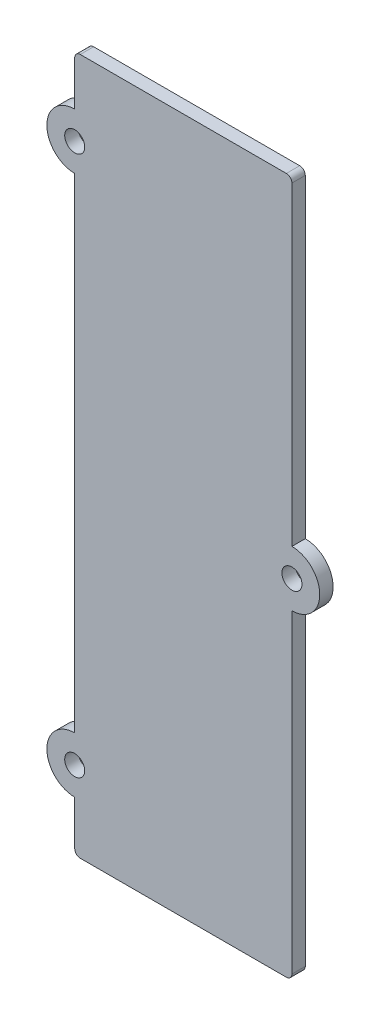
ISO-10303-21;
HEADER;
FILE_DESCRIPTION(('STEP AP214'),'2;1');
FILE_NAME('part.step','',(''),(''),'','','');
FILE_SCHEMA(('AUTOMOTIVE_DESIGN { 1 0 10303 214 1 1 1 1 }'));
ENDSEC;
DATA;
#1=APPLICATION_CONTEXT('core data for automotive mechanical design processes');
#2=APPLICATION_PROTOCOL_DEFINITION('international standard','automotive_design',2000,#1);
#3=PRODUCT_CONTEXT('',#1,'mechanical');
#4=PRODUCT('Part','Part','',(#3));
#5=PRODUCT_RELATED_PRODUCT_CATEGORY('part','',(#4));
#6=PRODUCT_DEFINITION_FORMATION('','',#4);
#7=PRODUCT_DEFINITION_CONTEXT('part definition',#1,'design');
#8=PRODUCT_DEFINITION('design','',#6,#7);
#9=PRODUCT_DEFINITION_SHAPE('','',#8);
#10=(LENGTH_UNIT() NAMED_UNIT(*) SI_UNIT(.MILLI.,.METRE.));
#11=(NAMED_UNIT(*) PLANE_ANGLE_UNIT() SI_UNIT($,.RADIAN.));
#12=(NAMED_UNIT(*) SI_UNIT($,.STERADIAN.) SOLID_ANGLE_UNIT());
#13=UNCERTAINTY_MEASURE_WITH_UNIT(LENGTH_MEASURE(1.E-05),#10,'distance_accuracy_value','');
#14=(GEOMETRIC_REPRESENTATION_CONTEXT(3) GLOBAL_UNCERTAINTY_ASSIGNED_CONTEXT((#13)) GLOBAL_UNIT_ASSIGNED_CONTEXT((#10,
#11,#12)) REPRESENTATION_CONTEXT('',''));
#15=CARTESIAN_POINT('',(0.,0.,0.));
#16=DIRECTION('',(0.,0.,1.));
#17=DIRECTION('',(1.,0.,0.));
#18=AXIS2_PLACEMENT_3D('',#15,#16,#17);
#19=CARTESIAN_POINT('',(0.,0.,1.524));
#20=DIRECTION('',(1.,0.,0.));
#21=DIRECTION('',(0.,0.,-1.));
#22=AXIS2_PLACEMENT_3D('',#19,#20,#21);
#23=PLANE('',#22);
#24=DIRECTION('',(0.,-1.,0.));
#25=VECTOR('',#24,1.);
#26=CARTESIAN_POINT('',(0.,0.,1.524));
#27=LINE('',#26,#25);
#28=CARTESIAN_POINT('',(0.,78.74,1.524));
#29=VERTEX_POINT('',#28);
#30=CARTESIAN_POINT('',(0.,73.66,1.524));
#31=VERTEX_POINT('',#30);
#32=EDGE_CURVE('E142',#29,#31,#27,.T.);
#33=ORIENTED_EDGE('',*,*,#32,.F.);
#34=DIRECTION('',(0.,0.,-1.));
#35=VECTOR('',#34,1.);
#36=CARTESIAN_POINT('',(0.,78.74,1.524));
#37=LINE('',#36,#35);
#38=CARTESIAN_POINT('',(0.,78.74,0.));
#39=VERTEX_POINT('',#38);
#40=EDGE_CURVE('E218',#29,#39,#37,.T.);
#41=ORIENTED_EDGE('',*,*,#40,.T.);
#42=DIRECTION('',(0.,-1.,0.));
#43=VECTOR('',#42,1.);
#44=CARTESIAN_POINT('',(0.,0.,0.));
#45=LINE('',#44,#43);
#46=CARTESIAN_POINT('',(0.,73.66,0.));
#47=VERTEX_POINT('',#46);
#48=EDGE_CURVE('E171',#39,#47,#45,.T.);
#49=ORIENTED_EDGE('',*,*,#48,.T.);
#50=DIRECTION('',(0.,0.,1.));
#51=VECTOR('',#50,1.);
#52=CARTESIAN_POINT('',(0.,73.66,-8.98025612106916));
#53=LINE('',#52,#51);
#54=EDGE_CURVE('E162',#47,#31,#53,.T.);
#55=ORIENTED_EDGE('',*,*,#54,.T.);
#56=EDGE_LOOP('',(#33,#41,#49,#55));
#57=FACE_BOUND('',#56,.T.);
#58=ADVANCED_FACE('F39',(#57),#23,.F.);
#59=CARTESIAN_POINT('',(24.765,0.,1.524));
#60=DIRECTION('',(-1.,0.,0.));
#61=DIRECTION('',(0.,0.,1.));
#62=AXIS2_PLACEMENT_3D('',#59,#60,#61);
#63=PLANE('',#62);
#64=DIRECTION('',(0.,1.,0.));
#65=VECTOR('',#64,1.);
#66=CARTESIAN_POINT('',(24.765,0.,1.524));
#67=LINE('',#66,#65);
#68=CARTESIAN_POINT('',(24.765,0.635,1.524));
#69=VERTEX_POINT('',#68);
#70=CARTESIAN_POINT('',(24.765,36.5125,1.524));
#71=VERTEX_POINT('',#70);
#72=EDGE_CURVE('E212',#69,#71,#67,.T.);
#73=ORIENTED_EDGE('',*,*,#72,.F.);
#74=DIRECTION('',(0.,0.,-1.));
#75=VECTOR('',#74,1.);
#76=CARTESIAN_POINT('',(24.765,0.635,1.524));
#77=LINE('',#76,#75);
#78=CARTESIAN_POINT('',(24.765,0.635,0.));
#79=VERTEX_POINT('',#78);
#80=EDGE_CURVE('E267',#69,#79,#77,.T.);
#81=ORIENTED_EDGE('',*,*,#80,.T.);
#82=DIRECTION('',(0.,1.,0.));
#83=VECTOR('',#82,1.);
#84=CARTESIAN_POINT('',(24.765,0.,0.));
#85=LINE('',#84,#83);
#86=CARTESIAN_POINT('',(24.765,36.5125,0.));
#87=VERTEX_POINT('',#86);
#88=EDGE_CURVE('E227',#79,#87,#85,.T.);
#89=ORIENTED_EDGE('',*,*,#88,.T.);
#90=DIRECTION('',(0.,0.,1.));
#91=VECTOR('',#90,1.);
#92=CARTESIAN_POINT('',(24.765,36.5125,-8.98025612106916));
#93=LINE('',#92,#91);
#94=EDGE_CURVE('E189',#87,#71,#93,.T.);
#95=ORIENTED_EDGE('',*,*,#94,.T.);
#96=EDGE_LOOP('',(#73,#81,#89,#95));
#97=FACE_BOUND('',#96,.T.);
#98=ADVANCED_FACE('F288',(#97),#63,.F.);
#99=CARTESIAN_POINT('',(0.,67.31,1.524));
#100=VERTEX_POINT('',#99);
#101=CARTESIAN_POINT('',(0.,12.065,1.524));
#102=VERTEX_POINT('',#101);
#103=EDGE_CURVE('E156',#100,#102,#27,.T.);
#104=ORIENTED_EDGE('',*,*,#103,.F.);
#105=DIRECTION('',(0.,0.,1.));
#106=VECTOR('',#105,1.);
#107=CARTESIAN_POINT('',(0.,67.31,-8.98025612106916));
#108=LINE('',#107,#106);
#109=CARTESIAN_POINT('',(0.,67.31,0.));
#110=VERTEX_POINT('',#109);
#111=EDGE_CURVE('E165',#100,#110,#108,.F.);
#112=ORIENTED_EDGE('',*,*,#111,.T.);
#113=CARTESIAN_POINT('',(0.,12.065,0.));
#114=VERTEX_POINT('',#113);
#115=EDGE_CURVE('E222',#110,#114,#45,.T.);
#116=ORIENTED_EDGE('',*,*,#115,.T.);
#117=DIRECTION('',(0.,0.,1.));
#118=VECTOR('',#117,1.);
#119=CARTESIAN_POINT('',(0.,12.065,-8.98025612106916));
#120=LINE('',#119,#118);
#121=EDGE_CURVE('E204',#114,#102,#120,.T.);
#122=ORIENTED_EDGE('',*,*,#121,.T.);
#123=EDGE_LOOP('',(#104,#112,#116,#122));
#124=FACE_BOUND('',#123,.T.);
#125=ADVANCED_FACE('F320',(#124),#23,.F.);
#126=CARTESIAN_POINT('',(0.,5.715,0.));
#127=VERTEX_POINT('',#126);
#128=CARTESIAN_POINT('',(0.,0.635,0.));
#129=VERTEX_POINT('',#128);
#130=EDGE_CURVE('E207',#127,#129,#45,.T.);
#131=ORIENTED_EDGE('',*,*,#130,.T.);
#132=DIRECTION('',(0.,0.,-1.));
#133=VECTOR('',#132,1.);
#134=CARTESIAN_POINT('',(0.,0.635,1.524));
#135=LINE('',#134,#133);
#136=CARTESIAN_POINT('',(0.,0.635,1.524));
#137=VERTEX_POINT('',#136);
#138=EDGE_CURVE('E11',#129,#137,#135,.F.);
#139=ORIENTED_EDGE('',*,*,#138,.T.);
#140=CARTESIAN_POINT('',(0.,5.715,1.524));
#141=VERTEX_POINT('',#140);
#142=EDGE_CURVE('E158',#141,#137,#27,.T.);
#143=ORIENTED_EDGE('',*,*,#142,.F.);
#144=DIRECTION('',(0.,0.,1.));
#145=VECTOR('',#144,1.);
#146=CARTESIAN_POINT('',(0.,5.715,-8.98025612106916));
#147=LINE('',#146,#145);
#148=EDGE_CURVE('E200',#141,#127,#147,.F.);
#149=ORIENTED_EDGE('',*,*,#148,.T.);
#150=EDGE_LOOP('',(#131,#139,#143,#149));
#151=FACE_BOUND('',#150,.T.);
#152=ADVANCED_FACE('F309',(#151),#23,.F.);
#153=CARTESIAN_POINT('',(0.,0.,1.524));
#154=DIRECTION('',(0.,1.,0.));
#155=DIRECTION('',(0.,0.,1.));
#156=AXIS2_PLACEMENT_3D('',#153,#154,#155);
#157=PLANE('',#156);
#158=DIRECTION('',(1.,0.,0.));
#159=VECTOR('',#158,1.);
#160=CARTESIAN_POINT('',(0.,0.,0.));
#161=LINE('',#160,#159);
#162=CARTESIAN_POINT('',(0.635,0.,0.));
#163=VERTEX_POINT('',#162);
#164=CARTESIAN_POINT('',(24.13,0.,0.));
#165=VERTEX_POINT('',#164);
#166=EDGE_CURVE('E221',#163,#165,#161,.T.);
#167=ORIENTED_EDGE('',*,*,#166,.T.);
#168=DIRECTION('',(0.,0.,-1.));
#169=VECTOR('',#168,1.);
#170=CARTESIAN_POINT('',(24.13,0.,1.524));
#171=LINE('',#170,#169);
#172=CARTESIAN_POINT('',(24.13,0.,1.524));
#173=VERTEX_POINT('',#172);
#174=EDGE_CURVE('E48',#165,#173,#171,.F.);
#175=ORIENTED_EDGE('',*,*,#174,.T.);
#176=DIRECTION('',(1.,0.,0.));
#177=VECTOR('',#176,1.);
#178=CARTESIAN_POINT('',(0.,0.,1.524));
#179=LINE('',#178,#177);
#180=CARTESIAN_POINT('',(0.635,0.,1.524));
#181=VERTEX_POINT('',#180);
#182=EDGE_CURVE('E155',#181,#173,#179,.T.);
#183=ORIENTED_EDGE('',*,*,#182,.F.);
#184=DIRECTION('',(0.,0.,-1.));
#185=VECTOR('',#184,1.);
#186=CARTESIAN_POINT('',(0.635,0.,1.524));
#187=LINE('',#186,#185);
#188=EDGE_CURVE('E271',#181,#163,#187,.T.);
#189=ORIENTED_EDGE('',*,*,#188,.T.);
#190=EDGE_LOOP('',(#167,#175,#183,#189));
#191=FACE_BOUND('',#190,.T.);
#192=ADVANCED_FACE('F278',(#191),#157,.F.);
#193=CARTESIAN_POINT('',(24.765,42.8625,0.));
#194=VERTEX_POINT('',#193);
#195=CARTESIAN_POINT('',(24.765,78.74,0.));
#196=VERTEX_POINT('',#195);
#197=EDGE_CURVE('E226',#194,#196,#85,.T.);
#198=ORIENTED_EDGE('',*,*,#197,.T.);
#199=DIRECTION('',(0.,0.,-1.));
#200=VECTOR('',#199,1.);
#201=CARTESIAN_POINT('',(24.765,78.74,1.524));
#202=LINE('',#201,#200);
#203=CARTESIAN_POINT('',(24.765,78.74,1.524));
#204=VERTEX_POINT('',#203);
#205=EDGE_CURVE('E55',#196,#204,#202,.F.);
#206=ORIENTED_EDGE('',*,*,#205,.T.);
#207=CARTESIAN_POINT('',(24.765,42.8625,1.524));
#208=VERTEX_POINT('',#207);
#209=EDGE_CURVE('E211',#208,#204,#67,.T.);
#210=ORIENTED_EDGE('',*,*,#209,.F.);
#211=DIRECTION('',(0.,0.,1.));
#212=VECTOR('',#211,1.);
#213=CARTESIAN_POINT('',(24.765,42.8625,-8.98025612106916));
#214=LINE('',#213,#212);
#215=EDGE_CURVE('E185',#208,#194,#214,.F.);
#216=ORIENTED_EDGE('',*,*,#215,.T.);
#217=EDGE_LOOP('',(#198,#206,#210,#216));
#218=FACE_BOUND('',#217,.T.);
#219=ADVANCED_FACE('F297',(#218),#63,.F.);
#220=CARTESIAN_POINT('',(0.,79.375,1.524));
#221=DIRECTION('',(0.,-1.,0.));
#222=DIRECTION('',(0.,0.,-1.));
#223=AXIS2_PLACEMENT_3D('',#220,#221,#222);
#224=PLANE('',#223);
#225=DIRECTION('',(-1.,0.,0.));
#226=VECTOR('',#225,1.);
#227=CARTESIAN_POINT('',(0.,79.375,0.));
#228=LINE('',#227,#226);
#229=CARTESIAN_POINT('',(24.13,79.375,0.));
#230=VERTEX_POINT('',#229);
#231=CARTESIAN_POINT('',(0.635,79.375,0.));
#232=VERTEX_POINT('',#231);
#233=EDGE_CURVE('E230',#230,#232,#228,.T.);
#234=ORIENTED_EDGE('',*,*,#233,.T.);
#235=DIRECTION('',(0.,0.,-1.));
#236=VECTOR('',#235,1.);
#237=CARTESIAN_POINT('',(0.635,79.375,1.524));
#238=LINE('',#237,#236);
#239=CARTESIAN_POINT('',(0.635,79.375,1.524));
#240=VERTEX_POINT('',#239);
#241=EDGE_CURVE('E252',#232,#240,#238,.F.);
#242=ORIENTED_EDGE('',*,*,#241,.T.);
#243=DIRECTION('',(-1.,0.,0.));
#244=VECTOR('',#243,1.);
#245=CARTESIAN_POINT('',(0.,79.375,1.524));
#246=LINE('',#245,#244);
#247=CARTESIAN_POINT('',(24.13,79.375,1.524));
#248=VERTEX_POINT('',#247);
#249=EDGE_CURVE('E215',#248,#240,#246,.T.);
#250=ORIENTED_EDGE('',*,*,#249,.F.);
#251=DIRECTION('',(0.,0.,-1.));
#252=VECTOR('',#251,1.);
#253=CARTESIAN_POINT('',(24.13,79.375,1.524));
#254=LINE('',#253,#252);
#255=EDGE_CURVE('E248',#248,#230,#254,.T.);
#256=ORIENTED_EDGE('',*,*,#255,.T.);
#257=EDGE_LOOP('',(#234,#242,#250,#256));
#258=FACE_BOUND('',#257,.T.);
#259=ADVANCED_FACE('F336',(#258),#224,.F.);
#260=CARTESIAN_POINT('',(0.,0.,1.524));
#261=DIRECTION('',(0.,0.,-1.));
#262=DIRECTION('',(-1.,0.,0.));
#263=AXIS2_PLACEMENT_3D('',#260,#261,#262);
#264=PLANE('',#263);
#265=CARTESIAN_POINT('',(0.,8.89,1.524));
#266=DIRECTION('',(0.,0.,1.));
#267=DIRECTION('',(1.,0.,0.));
#268=AXIS2_PLACEMENT_3D('',#265,#266,#267);
#269=CIRCLE('',#268,1.143);
#270=CARTESIAN_POINT('',(1.143,8.89,1.524));
#271=VERTEX_POINT('',#270);
#272=EDGE_CURVE('E376',#271,#271,#269,.T.);
#273=ORIENTED_EDGE('',*,*,#272,.F.);
#274=EDGE_LOOP('',(#273));
#275=FACE_BOUND('',#274,.T.);
#276=CARTESIAN_POINT('',(24.765,39.6875,1.524));
#277=DIRECTION('',(0.,0.,1.));
#278=DIRECTION('',(1.,0.,0.));
#279=AXIS2_PLACEMENT_3D('',#276,#277,#278);
#280=CIRCLE('',#279,1.143);
#281=CARTESIAN_POINT('',(25.908,39.6875,1.524));
#282=VERTEX_POINT('',#281);
#283=EDGE_CURVE('E384',#282,#282,#280,.T.);
#284=ORIENTED_EDGE('',*,*,#283,.F.);
#285=EDGE_LOOP('',(#284));
#286=FACE_BOUND('',#285,.T.);
#287=CARTESIAN_POINT('',(0.,70.485,1.524));
#288=DIRECTION('',(0.,0.,1.));
#289=DIRECTION('',(1.,0.,0.));
#290=AXIS2_PLACEMENT_3D('',#287,#288,#289);
#291=CIRCLE('',#290,1.143);
#292=CARTESIAN_POINT('',(1.143,70.485,1.524));
#293=VERTEX_POINT('',#292);
#294=EDGE_CURVE('E394',#293,#293,#291,.T.);
#295=ORIENTED_EDGE('',*,*,#294,.F.);
#296=EDGE_LOOP('',(#295));
#297=FACE_BOUND('',#296,.T.);
#298=ORIENTED_EDGE('',*,*,#249,.T.);
#299=CARTESIAN_POINT('',(0.635,78.74,1.524));
#300=DIRECTION('',(0.,0.,-1.));
#301=DIRECTION('',(-1.,0.,0.));
#302=AXIS2_PLACEMENT_3D('',#299,#300,#301);
#303=CIRCLE('',#302,0.635);
#304=EDGE_CURVE('E149',#240,#29,#303,.F.);
#305=ORIENTED_EDGE('',*,*,#304,.T.);
#306=ORIENTED_EDGE('',*,*,#32,.T.);
#307=CARTESIAN_POINT('',(0.,70.485,1.524));
#308=DIRECTION('',(0.,0.,1.));
#309=DIRECTION('',(1.,0.,0.));
#310=AXIS2_PLACEMENT_3D('',#307,#308,#309);
#311=CIRCLE('',#310,3.175);
#312=EDGE_CURVE('E146',#31,#100,#311,.T.);
#313=ORIENTED_EDGE('',*,*,#312,.T.);
#314=ORIENTED_EDGE('',*,*,#103,.T.);
#315=CARTESIAN_POINT('',(0.,8.89,1.524));
#316=DIRECTION('',(0.,0.,1.));
#317=DIRECTION('',(1.,0.,0.));
#318=AXIS2_PLACEMENT_3D('',#315,#316,#317);
#319=CIRCLE('',#318,3.175);
#320=EDGE_CURVE('E193',#102,#141,#319,.T.);
#321=ORIENTED_EDGE('',*,*,#320,.T.);
#322=ORIENTED_EDGE('',*,*,#142,.T.);
#323=CARTESIAN_POINT('',(0.635,0.635,1.524));
#324=DIRECTION('',(0.,0.,-1.));
#325=DIRECTION('',(-1.,0.,0.));
#326=AXIS2_PLACEMENT_3D('',#323,#324,#325);
#327=CIRCLE('',#326,0.635);
#328=EDGE_CURVE('E255',#137,#181,#327,.F.);
#329=ORIENTED_EDGE('',*,*,#328,.T.);
#330=ORIENTED_EDGE('',*,*,#182,.T.);
#331=CARTESIAN_POINT('',(24.13,0.635,1.524));
#332=DIRECTION('',(0.,0.,-1.));
#333=DIRECTION('',(-1.,0.,0.));
#334=AXIS2_PLACEMENT_3D('',#331,#332,#333);
#335=CIRCLE('',#334,0.635);
#336=EDGE_CURVE('E63',#173,#69,#335,.F.);
#337=ORIENTED_EDGE('',*,*,#336,.T.);
#338=ORIENTED_EDGE('',*,*,#72,.T.);
#339=CARTESIAN_POINT('',(24.765,39.6875,1.524));
#340=DIRECTION('',(0.,0.,1.));
#341=DIRECTION('',(1.,0.,0.));
#342=AXIS2_PLACEMENT_3D('',#339,#340,#341);
#343=CIRCLE('',#342,3.175);
#344=EDGE_CURVE('E173',#71,#208,#343,.T.);
#345=ORIENTED_EDGE('',*,*,#344,.T.);
#346=ORIENTED_EDGE('',*,*,#209,.T.);
#347=CARTESIAN_POINT('',(24.13,78.74,1.524));
#348=DIRECTION('',(0.,0.,-1.));
#349=DIRECTION('',(-1.,0.,0.));
#350=AXIS2_PLACEMENT_3D('',#347,#348,#349);
#351=CIRCLE('',#350,0.635);
#352=EDGE_CURVE('E260',#204,#248,#351,.F.);
#353=ORIENTED_EDGE('',*,*,#352,.T.);
#354=EDGE_LOOP('',(#298,#305,#306,#313,#314,#321,#322,#329,#330,#337,#338,#345,#346,#353));
#355=FACE_BOUND('',#354,.T.);
#356=ADVANCED_FACE('F145',(#275,#286,#297,#355),#264,.F.);
#357=CARTESIAN_POINT('',(0.,0.,0.));
#358=DIRECTION('',(0.,0.,-1.));
#359=DIRECTION('',(-1.,0.,0.));
#360=AXIS2_PLACEMENT_3D('',#357,#358,#359);
#361=PLANE('',#360);
#362=CARTESIAN_POINT('',(0.,8.89,0.));
#363=DIRECTION('',(0.,0.,1.));
#364=DIRECTION('',(1.,0.,0.));
#365=AXIS2_PLACEMENT_3D('',#362,#363,#364);
#366=CIRCLE('',#365,1.143);
#367=CARTESIAN_POINT('',(1.143,8.89,0.));
#368=VERTEX_POINT('',#367);
#369=EDGE_CURVE('E168',#368,#368,#366,.T.);
#370=ORIENTED_EDGE('',*,*,#369,.T.);
#371=EDGE_LOOP('',(#370));
#372=FACE_BOUND('',#371,.T.);
#373=CARTESIAN_POINT('',(24.765,39.6875,0.));
#374=DIRECTION('',(0.,0.,1.));
#375=DIRECTION('',(1.,0.,0.));
#376=AXIS2_PLACEMENT_3D('',#373,#374,#375);
#377=CIRCLE('',#376,1.143);
#378=CARTESIAN_POINT('',(25.908,39.6875,0.));
#379=VERTEX_POINT('',#378);
#380=EDGE_CURVE('E378',#379,#379,#377,.T.);
#381=ORIENTED_EDGE('',*,*,#380,.T.);
#382=EDGE_LOOP('',(#381));
#383=FACE_BOUND('',#382,.T.);
#384=CARTESIAN_POINT('',(0.,70.485,0.));
#385=DIRECTION('',(0.,0.,1.));
#386=DIRECTION('',(1.,0.,0.));
#387=AXIS2_PLACEMENT_3D('',#384,#385,#386);
#388=CIRCLE('',#387,1.143);
#389=CARTESIAN_POINT('',(1.143,70.485,0.));
#390=VERTEX_POINT('',#389);
#391=EDGE_CURVE('E390',#390,#390,#388,.T.);
#392=ORIENTED_EDGE('',*,*,#391,.T.);
#393=EDGE_LOOP('',(#392));
#394=FACE_BOUND('',#393,.T.);
#395=ORIENTED_EDGE('',*,*,#48,.F.);
#396=CARTESIAN_POINT('',(0.635,78.74,0.));
#397=DIRECTION('',(0.,0.,-1.));
#398=DIRECTION('',(-1.,0.,0.));
#399=AXIS2_PLACEMENT_3D('',#396,#397,#398);
#400=CIRCLE('',#399,0.635);
#401=EDGE_CURVE('E245',#39,#232,#400,.T.);
#402=ORIENTED_EDGE('',*,*,#401,.T.);
#403=ORIENTED_EDGE('',*,*,#233,.F.);
#404=CARTESIAN_POINT('',(24.13,78.74,0.));
#405=DIRECTION('',(0.,0.,-1.));
#406=DIRECTION('',(-1.,0.,0.));
#407=AXIS2_PLACEMENT_3D('',#404,#405,#406);
#408=CIRCLE('',#407,0.635);
#409=EDGE_CURVE('E242',#230,#196,#408,.T.);
#410=ORIENTED_EDGE('',*,*,#409,.T.);
#411=ORIENTED_EDGE('',*,*,#197,.F.);
#412=CARTESIAN_POINT('',(24.765,39.6875,0.));
#413=DIRECTION('',(0.,0.,-1.));
#414=DIRECTION('',(-1.,0.,0.));
#415=AXIS2_PLACEMENT_3D('',#412,#413,#414);
#416=CIRCLE('',#415,3.175);
#417=EDGE_CURVE('E178',#87,#194,#416,.F.);
#418=ORIENTED_EDGE('',*,*,#417,.F.);
#419=ORIENTED_EDGE('',*,*,#88,.F.);
#420=CARTESIAN_POINT('',(24.13,0.635,0.));
#421=DIRECTION('',(0.,0.,-1.));
#422=DIRECTION('',(-1.,0.,0.));
#423=AXIS2_PLACEMENT_3D('',#420,#421,#422);
#424=CIRCLE('',#423,0.635);
#425=EDGE_CURVE('E239',#79,#165,#424,.T.);
#426=ORIENTED_EDGE('',*,*,#425,.T.);
#427=ORIENTED_EDGE('',*,*,#166,.F.);
#428=CARTESIAN_POINT('',(0.635,0.635,0.));
#429=DIRECTION('',(0.,0.,-1.));
#430=DIRECTION('',(-1.,0.,0.));
#431=AXIS2_PLACEMENT_3D('',#428,#429,#430);
#432=CIRCLE('',#431,0.635);
#433=EDGE_CURVE('E236',#163,#129,#432,.T.);
#434=ORIENTED_EDGE('',*,*,#433,.T.);
#435=ORIENTED_EDGE('',*,*,#130,.F.);
#436=CARTESIAN_POINT('',(0.,8.89,0.));
#437=DIRECTION('',(0.,0.,-1.));
#438=DIRECTION('',(-1.,0.,0.));
#439=AXIS2_PLACEMENT_3D('',#436,#437,#438);
#440=CIRCLE('',#439,3.175);
#441=EDGE_CURVE('E197',#114,#127,#440,.F.);
#442=ORIENTED_EDGE('',*,*,#441,.F.);
#443=ORIENTED_EDGE('',*,*,#115,.F.);
#444=CARTESIAN_POINT('',(0.,70.485,0.));
#445=DIRECTION('',(0.,0.,-1.));
#446=DIRECTION('',(-1.,0.,0.));
#447=AXIS2_PLACEMENT_3D('',#444,#445,#446);
#448=CIRCLE('',#447,3.175);
#449=EDGE_CURVE('E167',#47,#110,#448,.F.);
#450=ORIENTED_EDGE('',*,*,#449,.F.);
#451=EDGE_LOOP('',(#395,#402,#403,#410,#411,#418,#419,#426,#427,#434,#435,#442,#443,#450));
#452=FACE_BOUND('',#451,.T.);
#453=ADVANCED_FACE('F292',(#372,#383,#394,#452),#361,.T.);
#454=CARTESIAN_POINT('',(0.,8.89,-8.98025612106916));
#455=DIRECTION('',(0.,0.,1.));
#456=DIRECTION('',(1.,0.,0.));
#457=AXIS2_PLACEMENT_3D('',#454,#455,#456);
#458=CYLINDRICAL_SURFACE('',#457,3.175);
#459=ORIENTED_EDGE('',*,*,#121,.F.);
#460=ORIENTED_EDGE('',*,*,#441,.T.);
#461=ORIENTED_EDGE('',*,*,#148,.F.);
#462=ORIENTED_EDGE('',*,*,#320,.F.);
#463=EDGE_LOOP('',(#459,#460,#461,#462));
#464=FACE_BOUND('',#463,.T.);
#465=ADVANCED_FACE('F343',(#464),#458,.T.);
#466=CARTESIAN_POINT('',(24.765,39.6875,-8.98025612106916));
#467=DIRECTION('',(0.,0.,1.));
#468=DIRECTION('',(1.,0.,0.));
#469=AXIS2_PLACEMENT_3D('',#466,#467,#468);
#470=CYLINDRICAL_SURFACE('',#469,3.175);
#471=ORIENTED_EDGE('',*,*,#94,.F.);
#472=ORIENTED_EDGE('',*,*,#417,.T.);
#473=ORIENTED_EDGE('',*,*,#215,.F.);
#474=ORIENTED_EDGE('',*,*,#344,.F.);
#475=EDGE_LOOP('',(#471,#472,#473,#474));
#476=FACE_BOUND('',#475,.T.);
#477=ADVANCED_FACE('F295',(#476),#470,.T.);
#478=CARTESIAN_POINT('',(0.,70.485,-8.98025612106916));
#479=DIRECTION('',(0.,0.,1.));
#480=DIRECTION('',(1.,0.,0.));
#481=AXIS2_PLACEMENT_3D('',#478,#479,#480);
#482=CYLINDRICAL_SURFACE('',#481,3.175);
#483=ORIENTED_EDGE('',*,*,#54,.F.);
#484=ORIENTED_EDGE('',*,*,#449,.T.);
#485=ORIENTED_EDGE('',*,*,#111,.F.);
#486=ORIENTED_EDGE('',*,*,#312,.F.);
#487=EDGE_LOOP('',(#483,#484,#485,#486));
#488=FACE_BOUND('',#487,.T.);
#489=ADVANCED_FACE('F161',(#488),#482,.T.);
#490=CARTESIAN_POINT('',(0.,70.485,0.));
#491=DIRECTION('',(0.,0.,1.));
#492=DIRECTION('',(1.,0.,0.));
#493=AXIS2_PLACEMENT_3D('',#490,#491,#492);
#494=CYLINDRICAL_SURFACE('',#493,1.143);
#495=CARTESIAN_POINT('',(1.143,70.485,0.));
#496=CARTESIAN_POINT('',(1.143,70.485,0.015875));
#497=CARTESIAN_POINT('',(1.143,70.485,0.03175));
#498=CARTESIAN_POINT('',(1.143,70.485,0.0635));
#499=CARTESIAN_POINT('',(1.143,70.485,0.079375));
#500=CARTESIAN_POINT('',(1.143,70.485,0.111125));
#501=CARTESIAN_POINT('',(1.143,70.485,0.127));
#502=CARTESIAN_POINT('',(1.143,70.485,0.15875));
#503=CARTESIAN_POINT('',(1.143,70.485,0.174625));
#504=CARTESIAN_POINT('',(1.143,70.485,0.206375));
#505=CARTESIAN_POINT('',(1.143,70.485,0.22225));
#506=CARTESIAN_POINT('',(1.143,70.485,0.254));
#507=CARTESIAN_POINT('',(1.143,70.485,0.269875));
#508=CARTESIAN_POINT('',(1.143,70.485,0.301625));
#509=CARTESIAN_POINT('',(1.143,70.485,0.3175));
#510=CARTESIAN_POINT('',(1.143,70.485,0.34925));
#511=CARTESIAN_POINT('',(1.143,70.485,0.365125));
#512=CARTESIAN_POINT('',(1.143,70.485,0.396875));
#513=CARTESIAN_POINT('',(1.143,70.485,0.41275));
#514=CARTESIAN_POINT('',(1.143,70.485,0.4445));
#515=CARTESIAN_POINT('',(1.143,70.485,0.460375));
#516=CARTESIAN_POINT('',(1.143,70.485,0.492125));
#517=CARTESIAN_POINT('',(1.143,70.485,0.508));
#518=CARTESIAN_POINT('',(1.143,70.485,0.53975));
#519=CARTESIAN_POINT('',(1.143,70.485,0.555625));
#520=CARTESIAN_POINT('',(1.143,70.485,0.587375));
#521=CARTESIAN_POINT('',(1.143,70.485,0.60325));
#522=CARTESIAN_POINT('',(1.143,70.485,0.635));
#523=CARTESIAN_POINT('',(1.143,70.485,0.650875));
#524=CARTESIAN_POINT('',(1.143,70.485,0.682625));
#525=CARTESIAN_POINT('',(1.143,70.485,0.6985));
#526=CARTESIAN_POINT('',(1.143,70.485,0.73025));
#527=CARTESIAN_POINT('',(1.143,70.485,0.746125));
#528=CARTESIAN_POINT('',(1.143,70.485,0.777875));
#529=CARTESIAN_POINT('',(1.143,70.485,0.79375));
#530=CARTESIAN_POINT('',(1.143,70.485,0.8255));
#531=CARTESIAN_POINT('',(1.143,70.485,0.841375));
#532=CARTESIAN_POINT('',(1.143,70.485,0.873125));
#533=CARTESIAN_POINT('',(1.143,70.485,0.889));
#534=CARTESIAN_POINT('',(1.143,70.485,0.92075));
#535=CARTESIAN_POINT('',(1.143,70.485,0.936625));
#536=CARTESIAN_POINT('',(1.143,70.485,0.968375));
#537=CARTESIAN_POINT('',(1.143,70.485,0.98425));
#538=CARTESIAN_POINT('',(1.143,70.485,1.016));
#539=CARTESIAN_POINT('',(1.143,70.485,1.031875));
#540=CARTESIAN_POINT('',(1.143,70.485,1.063625));
#541=CARTESIAN_POINT('',(1.143,70.485,1.0795));
#542=CARTESIAN_POINT('',(1.143,70.485,1.11125));
#543=CARTESIAN_POINT('',(1.143,70.485,1.127125));
#544=CARTESIAN_POINT('',(1.143,70.485,1.158875));
#545=CARTESIAN_POINT('',(1.143,70.485,1.17475));
#546=CARTESIAN_POINT('',(1.143,70.485,1.2065));
#547=CARTESIAN_POINT('',(1.143,70.485,1.222375));
#548=CARTESIAN_POINT('',(1.143,70.485,1.254125));
#549=CARTESIAN_POINT('',(1.143,70.485,1.27));
#550=CARTESIAN_POINT('',(1.143,70.485,1.30175));
#551=CARTESIAN_POINT('',(1.143,70.485,1.317625));
#552=CARTESIAN_POINT('',(1.143,70.485,1.349375));
#553=CARTESIAN_POINT('',(1.143,70.485,1.36525));
#554=CARTESIAN_POINT('',(1.143,70.485,1.397));
#555=CARTESIAN_POINT('',(1.143,70.485,1.412875));
#556=CARTESIAN_POINT('',(1.143,70.485,1.444625));
#557=CARTESIAN_POINT('',(1.143,70.485,1.4605));
#558=CARTESIAN_POINT('',(1.143,70.485,1.49225));
#559=CARTESIAN_POINT('',(1.143,70.485,1.508125));
#560=CARTESIAN_POINT('',(1.143,70.485,1.524));
#561=B_SPLINE_CURVE_WITH_KNOTS('',3,(#495,#496,#497,#498,#499,#500,#501,#502,#503,#504,#505,
#506,#507,#508,#509,#510,#511,#512,#513,#514,#515,#516,#517,#518,#519,#520,#521,#522,#523,#524,
#525,#526,#527,#528,#529,#530,#531,#532,#533,#534,#535,#536,#537,#538,#539,#540,#541,#542,#543,
#544,#545,#546,#547,#548,#549,#550,#551,#552,#553,#554,#555,#556,#557,#558,#559,#560),
.UNSPECIFIED.,.F.,.F.,(4,2,2,2,2,2,2,2,2,2,2,2,2,2,2,2,2,2,2,2,2,2,2,2,2,2,2,2,2,2,2,2,4),(0.,
0.047625,0.09525,0.142875,0.1905,0.238125,0.28575,0.333375,0.381,0.428625,0.47625,0.523875,
0.5715,0.619125,0.66675,0.714375,0.762,0.809625,0.85725,0.904875,0.9525,1.000125,1.04775,
1.095375,1.143,1.190625,1.23825,1.285875,1.3335,1.381125,1.42875,1.476375,1.524),.UNSPECIFIED.);
#562=EDGE_CURVE('BSEAM355',#390,#293,#561,.T.);
#563=ORIENTED_EDGE('',*,*,#391,.F.);
#564=ORIENTED_EDGE('',*,*,#294,.T.);
#565=ORIENTED_EDGE('',*,*,#562,.T.);
#566=ORIENTED_EDGE('',*,*,#562,.F.);
#567=EDGE_LOOP('',(#563,#565,#564,#566));
#568=FACE_BOUND('',#567,.T.);
#569=ADVANCED_FACE('F355',(#568),#494,.F.);
#570=CARTESIAN_POINT('',(24.765,39.6875,0.));
#571=DIRECTION('',(0.,0.,1.));
#572=DIRECTION('',(1.,0.,0.));
#573=AXIS2_PLACEMENT_3D('',#570,#571,#572);
#574=CYLINDRICAL_SURFACE('',#573,1.143);
#575=CARTESIAN_POINT('',(25.908,39.6875,0.));
#576=CARTESIAN_POINT('',(25.908,39.6875,0.015875));
#577=CARTESIAN_POINT('',(25.908,39.6875,0.03175));
#578=CARTESIAN_POINT('',(25.908,39.6875,0.0635));
#579=CARTESIAN_POINT('',(25.908,39.6875,0.079375));
#580=CARTESIAN_POINT('',(25.908,39.6875,0.111125));
#581=CARTESIAN_POINT('',(25.908,39.6875,0.127));
#582=CARTESIAN_POINT('',(25.908,39.6875,0.15875));
#583=CARTESIAN_POINT('',(25.908,39.6875,0.174625));
#584=CARTESIAN_POINT('',(25.908,39.6875,0.206375));
#585=CARTESIAN_POINT('',(25.908,39.6875,0.22225));
#586=CARTESIAN_POINT('',(25.908,39.6875,0.254));
#587=CARTESIAN_POINT('',(25.908,39.6875,0.269875));
#588=CARTESIAN_POINT('',(25.908,39.6875,0.301625));
#589=CARTESIAN_POINT('',(25.908,39.6875,0.3175));
#590=CARTESIAN_POINT('',(25.908,39.6875,0.34925));
#591=CARTESIAN_POINT('',(25.908,39.6875,0.365125));
#592=CARTESIAN_POINT('',(25.908,39.6875,0.396875));
#593=CARTESIAN_POINT('',(25.908,39.6875,0.41275));
#594=CARTESIAN_POINT('',(25.908,39.6875,0.4445));
#595=CARTESIAN_POINT('',(25.908,39.6875,0.460375));
#596=CARTESIAN_POINT('',(25.908,39.6875,0.492125));
#597=CARTESIAN_POINT('',(25.908,39.6875,0.508));
#598=CARTESIAN_POINT('',(25.908,39.6875,0.53975));
#599=CARTESIAN_POINT('',(25.908,39.6875,0.555625));
#600=CARTESIAN_POINT('',(25.908,39.6875,0.587375));
#601=CARTESIAN_POINT('',(25.908,39.6875,0.60325));
#602=CARTESIAN_POINT('',(25.908,39.6875,0.635));
#603=CARTESIAN_POINT('',(25.908,39.6875,0.650875));
#604=CARTESIAN_POINT('',(25.908,39.6875,0.682625));
#605=CARTESIAN_POINT('',(25.908,39.6875,0.6985));
#606=CARTESIAN_POINT('',(25.908,39.6875,0.73025));
#607=CARTESIAN_POINT('',(25.908,39.6875,0.746125));
#608=CARTESIAN_POINT('',(25.908,39.6875,0.777875));
#609=CARTESIAN_POINT('',(25.908,39.6875,0.79375));
#610=CARTESIAN_POINT('',(25.908,39.6875,0.8255));
#611=CARTESIAN_POINT('',(25.908,39.6875,0.841375));
#612=CARTESIAN_POINT('',(25.908,39.6875,0.873125));
#613=CARTESIAN_POINT('',(25.908,39.6875,0.889));
#614=CARTESIAN_POINT('',(25.908,39.6875,0.92075));
#615=CARTESIAN_POINT('',(25.908,39.6875,0.936625));
#616=CARTESIAN_POINT('',(25.908,39.6875,0.968375));
#617=CARTESIAN_POINT('',(25.908,39.6875,0.98425));
#618=CARTESIAN_POINT('',(25.908,39.6875,1.016));
#619=CARTESIAN_POINT('',(25.908,39.6875,1.031875));
#620=CARTESIAN_POINT('',(25.908,39.6875,1.063625));
#621=CARTESIAN_POINT('',(25.908,39.6875,1.0795));
#622=CARTESIAN_POINT('',(25.908,39.6875,1.11125));
#623=CARTESIAN_POINT('',(25.908,39.6875,1.127125));
#624=CARTESIAN_POINT('',(25.908,39.6875,1.158875));
#625=CARTESIAN_POINT('',(25.908,39.6875,1.17475));
#626=CARTESIAN_POINT('',(25.908,39.6875,1.2065));
#627=CARTESIAN_POINT('',(25.908,39.6875,1.222375));
#628=CARTESIAN_POINT('',(25.908,39.6875,1.254125));
#629=CARTESIAN_POINT('',(25.908,39.6875,1.27));
#630=CARTESIAN_POINT('',(25.908,39.6875,1.30175));
#631=CARTESIAN_POINT('',(25.908,39.6875,1.317625));
#632=CARTESIAN_POINT('',(25.908,39.6875,1.349375));
#633=CARTESIAN_POINT('',(25.908,39.6875,1.36525));
#634=CARTESIAN_POINT('',(25.908,39.6875,1.397));
#635=CARTESIAN_POINT('',(25.908,39.6875,1.412875));
#636=CARTESIAN_POINT('',(25.908,39.6875,1.444625));
#637=CARTESIAN_POINT('',(25.908,39.6875,1.4605));
#638=CARTESIAN_POINT('',(25.908,39.6875,1.49225));
#639=CARTESIAN_POINT('',(25.908,39.6875,1.508125));
#640=CARTESIAN_POINT('',(25.908,39.6875,1.524));
#641=B_SPLINE_CURVE_WITH_KNOTS('',3,(#575,#576,#577,#578,#579,#580,#581,#582,#583,#584,#585,
#586,#587,#588,#589,#590,#591,#592,#593,#594,#595,#596,#597,#598,#599,#600,#601,#602,#603,#604,
#605,#606,#607,#608,#609,#610,#611,#612,#613,#614,#615,#616,#617,#618,#619,#620,#621,#622,#623,
#624,#625,#626,#627,#628,#629,#630,#631,#632,#633,#634,#635,#636,#637,#638,#639,#640),
.UNSPECIFIED.,.F.,.F.,(4,2,2,2,2,2,2,2,2,2,2,2,2,2,2,2,2,2,2,2,2,2,2,2,2,2,2,2,2,2,2,2,4),(0.,
0.047625,0.09525,0.142875,0.1905,0.238125,0.28575,0.333375,0.381,0.428625,0.47625,0.523875,
0.5715,0.619125,0.66675,0.714375,0.762,0.809625,0.85725,0.904875,0.9525,1.000125,1.04775,
1.095375,1.143,1.190625,1.23825,1.285875,1.3335,1.381125,1.42875,1.476375,1.524),.UNSPECIFIED.);
#642=EDGE_CURVE('BSEAM358',#379,#282,#641,.T.);
#643=ORIENTED_EDGE('',*,*,#380,.F.);
#644=ORIENTED_EDGE('',*,*,#283,.T.);
#645=ORIENTED_EDGE('',*,*,#642,.T.);
#646=ORIENTED_EDGE('',*,*,#642,.F.);
#647=EDGE_LOOP('',(#643,#645,#644,#646));
#648=FACE_BOUND('',#647,.T.);
#649=ADVANCED_FACE('F358',(#648),#574,.F.);
#650=CARTESIAN_POINT('',(0.,8.89,0.));
#651=DIRECTION('',(0.,0.,1.));
#652=DIRECTION('',(1.,0.,0.));
#653=AXIS2_PLACEMENT_3D('',#650,#651,#652);
#654=CYLINDRICAL_SURFACE('',#653,1.143);
#655=CARTESIAN_POINT('',(1.143,8.89,0.));
#656=CARTESIAN_POINT('',(1.143,8.89,0.015875));
#657=CARTESIAN_POINT('',(1.143,8.89,0.03175));
#658=CARTESIAN_POINT('',(1.143,8.89,0.0635));
#659=CARTESIAN_POINT('',(1.143,8.89,0.079375));
#660=CARTESIAN_POINT('',(1.143,8.89,0.111125));
#661=CARTESIAN_POINT('',(1.143,8.89,0.127));
#662=CARTESIAN_POINT('',(1.143,8.89,0.15875));
#663=CARTESIAN_POINT('',(1.143,8.89,0.174625));
#664=CARTESIAN_POINT('',(1.143,8.89,0.206375));
#665=CARTESIAN_POINT('',(1.143,8.89,0.22225));
#666=CARTESIAN_POINT('',(1.143,8.89,0.254));
#667=CARTESIAN_POINT('',(1.143,8.89,0.269875));
#668=CARTESIAN_POINT('',(1.143,8.89,0.301625));
#669=CARTESIAN_POINT('',(1.143,8.89,0.3175));
#670=CARTESIAN_POINT('',(1.143,8.89,0.34925));
#671=CARTESIAN_POINT('',(1.143,8.89,0.365125));
#672=CARTESIAN_POINT('',(1.143,8.89,0.396875));
#673=CARTESIAN_POINT('',(1.143,8.89,0.41275));
#674=CARTESIAN_POINT('',(1.143,8.89,0.4445));
#675=CARTESIAN_POINT('',(1.143,8.89,0.460375));
#676=CARTESIAN_POINT('',(1.143,8.89,0.492125));
#677=CARTESIAN_POINT('',(1.143,8.89,0.508));
#678=CARTESIAN_POINT('',(1.143,8.89,0.53975));
#679=CARTESIAN_POINT('',(1.143,8.89,0.555625));
#680=CARTESIAN_POINT('',(1.143,8.89,0.587375));
#681=CARTESIAN_POINT('',(1.143,8.89,0.60325));
#682=CARTESIAN_POINT('',(1.143,8.89,0.635));
#683=CARTESIAN_POINT('',(1.143,8.89,0.650875));
#684=CARTESIAN_POINT('',(1.143,8.89,0.682625));
#685=CARTESIAN_POINT('',(1.143,8.89,0.6985));
#686=CARTESIAN_POINT('',(1.143,8.89,0.73025));
#687=CARTESIAN_POINT('',(1.143,8.89,0.746125));
#688=CARTESIAN_POINT('',(1.143,8.89,0.777875));
#689=CARTESIAN_POINT('',(1.143,8.89,0.79375));
#690=CARTESIAN_POINT('',(1.143,8.89,0.8255));
#691=CARTESIAN_POINT('',(1.143,8.89,0.841375));
#692=CARTESIAN_POINT('',(1.143,8.89,0.873125));
#693=CARTESIAN_POINT('',(1.143,8.89,0.889));
#694=CARTESIAN_POINT('',(1.143,8.89,0.92075));
#695=CARTESIAN_POINT('',(1.143,8.89,0.936625));
#696=CARTESIAN_POINT('',(1.143,8.89,0.968375));
#697=CARTESIAN_POINT('',(1.143,8.89,0.98425));
#698=CARTESIAN_POINT('',(1.143,8.89,1.016));
#699=CARTESIAN_POINT('',(1.143,8.89,1.031875));
#700=CARTESIAN_POINT('',(1.143,8.89,1.063625));
#701=CARTESIAN_POINT('',(1.143,8.89,1.0795));
#702=CARTESIAN_POINT('',(1.143,8.89,1.11125));
#703=CARTESIAN_POINT('',(1.143,8.89,1.127125));
#704=CARTESIAN_POINT('',(1.143,8.89,1.158875));
#705=CARTESIAN_POINT('',(1.143,8.89,1.17475));
#706=CARTESIAN_POINT('',(1.143,8.89,1.2065));
#707=CARTESIAN_POINT('',(1.143,8.89,1.222375));
#708=CARTESIAN_POINT('',(1.143,8.89,1.254125));
#709=CARTESIAN_POINT('',(1.143,8.89,1.27));
#710=CARTESIAN_POINT('',(1.143,8.89,1.30175));
#711=CARTESIAN_POINT('',(1.143,8.89,1.317625));
#712=CARTESIAN_POINT('',(1.143,8.89,1.349375));
#713=CARTESIAN_POINT('',(1.143,8.89,1.36525));
#714=CARTESIAN_POINT('',(1.143,8.89,1.397));
#715=CARTESIAN_POINT('',(1.143,8.89,1.412875));
#716=CARTESIAN_POINT('',(1.143,8.89,1.444625));
#717=CARTESIAN_POINT('',(1.143,8.89,1.4605));
#718=CARTESIAN_POINT('',(1.143,8.89,1.49225));
#719=CARTESIAN_POINT('',(1.143,8.89,1.508125));
#720=CARTESIAN_POINT('',(1.143,8.89,1.524));
#721=B_SPLINE_CURVE_WITH_KNOTS('',3,(#655,#656,#657,#658,#659,#660,#661,#662,#663,#664,#665,
#666,#667,#668,#669,#670,#671,#672,#673,#674,#675,#676,#677,#678,#679,#680,#681,#682,#683,#684,
#685,#686,#687,#688,#689,#690,#691,#692,#693,#694,#695,#696,#697,#698,#699,#700,#701,#702,#703,
#704,#705,#706,#707,#708,#709,#710,#711,#712,#713,#714,#715,#716,#717,#718,#719,#720),
.UNSPECIFIED.,.F.,.F.,(4,2,2,2,2,2,2,2,2,2,2,2,2,2,2,2,2,2,2,2,2,2,2,2,2,2,2,2,2,2,2,2,4),(0.,
0.047625,0.09525,0.142875,0.1905,0.238125,0.28575,0.333375,0.381,0.428625,0.47625,0.523875,
0.5715,0.619125,0.66675,0.714375,0.762,0.809625,0.85725,0.904875,0.9525,1.000125,1.04775,
1.095375,1.143,1.190625,1.23825,1.285875,1.3335,1.381125,1.42875,1.476375,1.524),.UNSPECIFIED.);
#722=EDGE_CURVE('BSEAM362',#368,#271,#721,.T.);
#723=ORIENTED_EDGE('',*,*,#369,.F.);
#724=ORIENTED_EDGE('',*,*,#272,.T.);
#725=ORIENTED_EDGE('',*,*,#722,.T.);
#726=ORIENTED_EDGE('',*,*,#722,.F.);
#727=EDGE_LOOP('',(#723,#725,#724,#726));
#728=FACE_BOUND('',#727,.T.);
#729=ADVANCED_FACE('F362',(#728),#654,.F.);
#730=CARTESIAN_POINT('',(0.635,78.74,1.524));
#731=DIRECTION('',(0.,0.,-1.));
#732=DIRECTION('',(-1.,0.,0.));
#733=AXIS2_PLACEMENT_3D('',#730,#731,#732);
#734=CYLINDRICAL_SURFACE('',#733,0.635);
#735=ORIENTED_EDGE('',*,*,#304,.F.);
#736=ORIENTED_EDGE('',*,*,#241,.F.);
#737=ORIENTED_EDGE('',*,*,#401,.F.);
#738=ORIENTED_EDGE('',*,*,#40,.F.);
#739=EDGE_LOOP('',(#735,#736,#737,#738));
#740=FACE_BOUND('',#739,.T.);
#741=ADVANCED_FACE('F365',(#740),#734,.T.);
#742=CARTESIAN_POINT('',(24.13,78.74,1.524));
#743=DIRECTION('',(0.,0.,-1.));
#744=DIRECTION('',(-1.,0.,0.));
#745=AXIS2_PLACEMENT_3D('',#742,#743,#744);
#746=CYLINDRICAL_SURFACE('',#745,0.635);
#747=ORIENTED_EDGE('',*,*,#352,.F.);
#748=ORIENTED_EDGE('',*,*,#205,.F.);
#749=ORIENTED_EDGE('',*,*,#409,.F.);
#750=ORIENTED_EDGE('',*,*,#255,.F.);
#751=EDGE_LOOP('',(#747,#748,#749,#750));
#752=FACE_BOUND('',#751,.T.);
#753=ADVANCED_FACE('F317',(#752),#746,.T.);
#754=CARTESIAN_POINT('',(24.13,0.635,1.524));
#755=DIRECTION('',(0.,0.,-1.));
#756=DIRECTION('',(-1.,0.,0.));
#757=AXIS2_PLACEMENT_3D('',#754,#755,#756);
#758=CYLINDRICAL_SURFACE('',#757,0.635);
#759=ORIENTED_EDGE('',*,*,#336,.F.);
#760=ORIENTED_EDGE('',*,*,#174,.F.);
#761=ORIENTED_EDGE('',*,*,#425,.F.);
#762=ORIENTED_EDGE('',*,*,#80,.F.);
#763=EDGE_LOOP('',(#759,#760,#761,#762));
#764=FACE_BOUND('',#763,.T.);
#765=ADVANCED_FACE('F285',(#764),#758,.T.);
#766=CARTESIAN_POINT('',(0.635,0.635,1.524));
#767=DIRECTION('',(0.,0.,-1.));
#768=DIRECTION('',(-1.,0.,0.));
#769=AXIS2_PLACEMENT_3D('',#766,#767,#768);
#770=CYLINDRICAL_SURFACE('',#769,0.635);
#771=ORIENTED_EDGE('',*,*,#328,.F.);
#772=ORIENTED_EDGE('',*,*,#138,.F.);
#773=ORIENTED_EDGE('',*,*,#433,.F.);
#774=ORIENTED_EDGE('',*,*,#188,.F.);
#775=EDGE_LOOP('',(#771,#772,#773,#774));
#776=FACE_BOUND('',#775,.T.);
#777=ADVANCED_FACE('F41',(#776),#770,.T.);
#778=CLOSED_SHELL('',(#58,#98,#125,#152,#192,#219,#259,#356,#453,#465,#477,#489,#569,#649,#729,
#741,#753,#765,#777));
#779=MANIFOLD_SOLID_BREP('B2',#778);
#780=ADVANCED_BREP_SHAPE_REPRESENTATION('',(#18,#779),#14);
#781=SHAPE_DEFINITION_REPRESENTATION(#9,#780);
ENDSEC;
END-ISO-10303-21;
